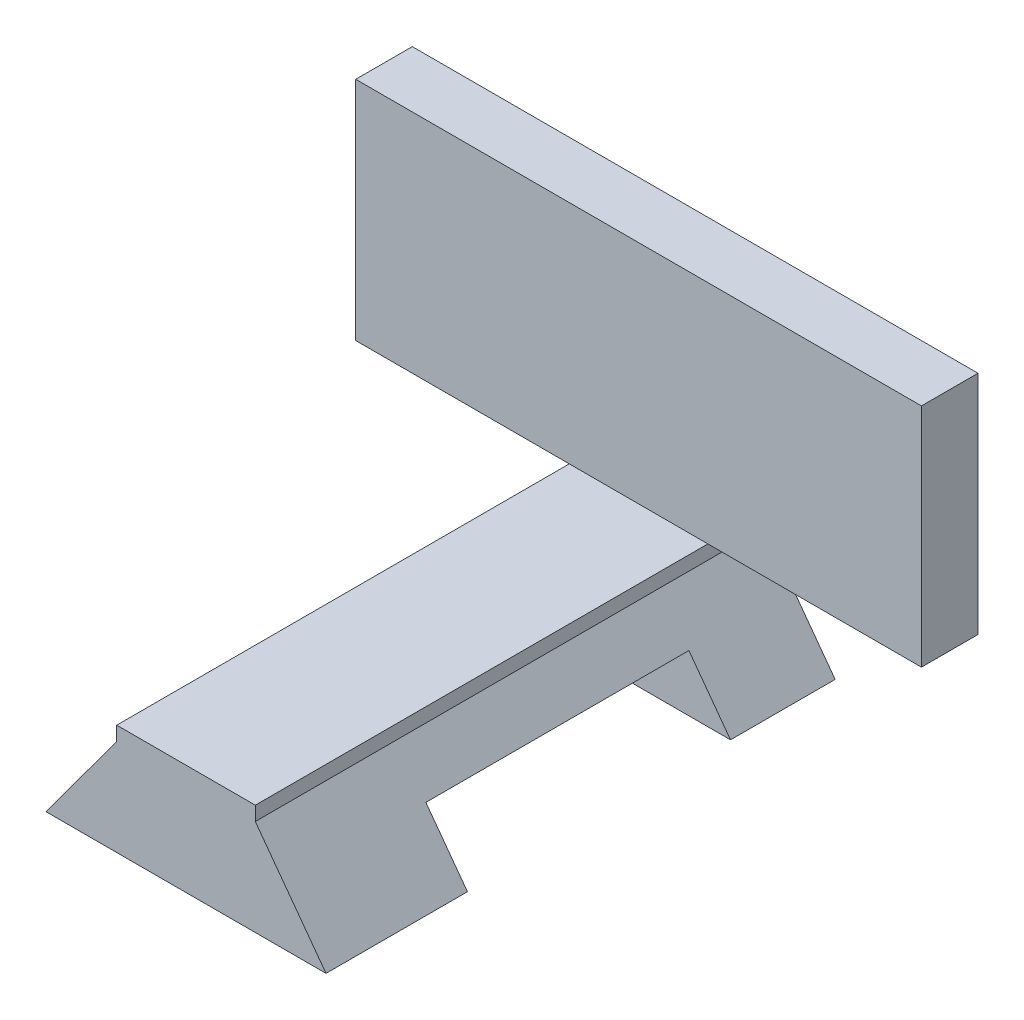
ISO-10303-21;
HEADER;
FILE_DESCRIPTION(('STEP AP214'),'2;1');
FILE_NAME('part.step','',(''),(''),'','','');
FILE_SCHEMA(('AUTOMOTIVE_DESIGN { 1 0 10303 214 1 1 1 1 }'));
ENDSEC;
DATA;
#1=APPLICATION_CONTEXT('core data for automotive mechanical design processes');
#2=APPLICATION_PROTOCOL_DEFINITION('international standard','automotive_design',2000,#1);
#3=PRODUCT_CONTEXT('',#1,'mechanical');
#4=PRODUCT('Part','Part','',(#3));
#5=PRODUCT_RELATED_PRODUCT_CATEGORY('part','',(#4));
#6=PRODUCT_DEFINITION_FORMATION('','',#4);
#7=PRODUCT_DEFINITION_CONTEXT('part definition',#1,'design');
#8=PRODUCT_DEFINITION('design','',#6,#7);
#9=PRODUCT_DEFINITION_SHAPE('','',#8);
#10=(LENGTH_UNIT() NAMED_UNIT(*) SI_UNIT(.MILLI.,.METRE.));
#11=(NAMED_UNIT(*) PLANE_ANGLE_UNIT() SI_UNIT($,.RADIAN.));
#12=(NAMED_UNIT(*) SI_UNIT($,.STERADIAN.) SOLID_ANGLE_UNIT());
#13=UNCERTAINTY_MEASURE_WITH_UNIT(LENGTH_MEASURE(1.E-05),#10,'distance_accuracy_value','');
#14=(GEOMETRIC_REPRESENTATION_CONTEXT(3) GLOBAL_UNCERTAINTY_ASSIGNED_CONTEXT((#13)) GLOBAL_UNIT_ASSIGNED_CONTEXT((#10,
#11,#12)) REPRESENTATION_CONTEXT('',''));
#15=CARTESIAN_POINT('',(0.,0.,0.));
#16=DIRECTION('',(0.,0.,1.));
#17=DIRECTION('',(1.,0.,0.));
#18=AXIS2_PLACEMENT_3D('',#15,#16,#17);
#19=CARTESIAN_POINT('',(-4.95,-3.4,18.));
#20=DIRECTION('',(0.,1.,0.));
#21=DIRECTION('',(-1.,0.,0.));
#22=AXIS2_PLACEMENT_3D('',#19,#20,#21);
#23=PLANE('',#22);
#24=DIRECTION('',(0.,0.,-1.));
#25=VECTOR('',#24,1.);
#26=CARTESIAN_POINT('',(-4.95,-3.4,18.));
#27=LINE('',#26,#25);
#28=CARTESIAN_POINT('',(-4.95,-3.4,18.));
#29=VERTEX_POINT('',#28);
#30=CARTESIAN_POINT('',(-4.95,-3.4,13.));
#31=VERTEX_POINT('',#30);
#32=EDGE_CURVE('E121',#29,#31,#27,.T.);
#33=ORIENTED_EDGE('',*,*,#32,.T.);
#34=DIRECTION('',(1.,0.,0.));
#35=VECTOR('',#34,1.);
#36=CARTESIAN_POINT('',(-10.,-3.4,13.));
#37=LINE('',#36,#35);
#38=CARTESIAN_POINT('',(4.95,-3.4,13.));
#39=VERTEX_POINT('',#38);
#40=EDGE_CURVE('E236',#31,#39,#37,.T.);
#41=ORIENTED_EDGE('',*,*,#40,.T.);
#42=DIRECTION('',(0.,0.,-1.));
#43=VECTOR('',#42,1.);
#44=CARTESIAN_POINT('',(4.95,-3.4,18.));
#45=LINE('',#44,#43);
#46=CARTESIAN_POINT('',(4.95,-3.4,18.));
#47=VERTEX_POINT('',#46);
#48=EDGE_CURVE('E133',#47,#39,#45,.T.);
#49=ORIENTED_EDGE('',*,*,#48,.F.);
#50=DIRECTION('',(1.,0.,0.));
#51=VECTOR('',#50,1.);
#52=CARTESIAN_POINT('',(-4.95,-3.4,18.));
#53=LINE('',#52,#51);
#54=EDGE_CURVE('E112',#29,#47,#53,.T.);
#55=ORIENTED_EDGE('',*,*,#54,.F.);
#56=EDGE_LOOP('',(#33,#41,#49,#55));
#57=FACE_BOUND('',#56,.T.);
#58=ADVANCED_FACE('F41',(#57),#23,.F.);
#59=CARTESIAN_POINT('',(-2.45,0.5,18.));
#60=DIRECTION('',(0.,-1.,0.));
#61=DIRECTION('',(1.,0.,0.));
#62=AXIS2_PLACEMENT_3D('',#59,#60,#61);
#63=PLANE('',#62);
#64=DIRECTION('',(1.,0.,0.));
#65=VECTOR('',#64,1.);
#66=CARTESIAN_POINT('',(-2.45,0.5,2.));
#67=LINE('',#66,#65);
#68=CARTESIAN_POINT('',(-2.45,0.5,2.));
#69=VERTEX_POINT('',#68);
#70=CARTESIAN_POINT('',(2.45,0.5,2.));
#71=VERTEX_POINT('',#70);
#72=EDGE_CURVE('E141',#69,#71,#67,.T.);
#73=ORIENTED_EDGE('',*,*,#72,.F.);
#74=DIRECTION('',(0.,0.,-1.));
#75=VECTOR('',#74,1.);
#76=CARTESIAN_POINT('',(-2.45,0.5,18.));
#77=LINE('',#76,#75);
#78=CARTESIAN_POINT('',(-2.45,0.5,18.));
#79=VERTEX_POINT('',#78);
#80=EDGE_CURVE('E157',#79,#69,#77,.T.);
#81=ORIENTED_EDGE('',*,*,#80,.F.);
#82=DIRECTION('',(-1.,0.,0.));
#83=VECTOR('',#82,1.);
#84=CARTESIAN_POINT('',(-2.45,0.5,18.));
#85=LINE('',#84,#83);
#86=CARTESIAN_POINT('',(2.45,0.500000000000001,18.));
#87=VERTEX_POINT('',#86);
#88=EDGE_CURVE('E98',#87,#79,#85,.T.);
#89=ORIENTED_EDGE('',*,*,#88,.F.);
#90=DIRECTION('',(0.,0.,-1.));
#91=VECTOR('',#90,1.);
#92=CARTESIAN_POINT('',(2.45,0.500000000000001,18.));
#93=LINE('',#92,#91);
#94=EDGE_CURVE('E160',#87,#71,#93,.T.);
#95=ORIENTED_EDGE('',*,*,#94,.T.);
#96=EDGE_LOOP('',(#73,#81,#89,#95));
#97=FACE_BOUND('',#96,.T.);
#98=ADVANCED_FACE('F190',(#97),#63,.F.);
#99=CARTESIAN_POINT('',(2.45,0.,18.));
#100=DIRECTION('',(-1.,0.,0.));
#101=DIRECTION('',(0.,0.,1.));
#102=AXIS2_PLACEMENT_3D('',#99,#100,#101);
#103=PLANE('',#102);
#104=DIRECTION('',(0.,0.,-1.));
#105=VECTOR('',#104,1.);
#106=CARTESIAN_POINT('',(2.45,0.5,2.));
#107=LINE('',#106,#105);
#108=CARTESIAN_POINT('',(2.45,0.5,0.));
#109=VERTEX_POINT('',#108);
#110=EDGE_CURVE('E270',#71,#109,#107,.T.);
#111=ORIENTED_EDGE('',*,*,#110,.F.);
#112=ORIENTED_EDGE('',*,*,#94,.F.);
#113=DIRECTION('',(0.,1.,0.));
#114=VECTOR('',#113,1.);
#115=CARTESIAN_POINT('',(2.45,0.,18.));
#116=LINE('',#115,#114);
#117=CARTESIAN_POINT('',(2.45,0.,18.));
#118=VERTEX_POINT('',#117);
#119=EDGE_CURVE('E152',#118,#87,#116,.T.);
#120=ORIENTED_EDGE('',*,*,#119,.F.);
#121=DIRECTION('',(0.,0.,-1.));
#122=VECTOR('',#121,1.);
#123=CARTESIAN_POINT('',(2.45,0.,18.));
#124=LINE('',#123,#122);
#125=CARTESIAN_POINT('',(2.45,0.,0.));
#126=VERTEX_POINT('',#125);
#127=EDGE_CURVE('E89',#118,#126,#124,.T.);
#128=ORIENTED_EDGE('',*,*,#127,.T.);
#129=DIRECTION('',(0.,1.,0.));
#130=VECTOR('',#129,1.);
#131=CARTESIAN_POINT('',(2.45,0.,0.));
#132=LINE('',#131,#130);
#133=EDGE_CURVE('E138',#126,#109,#132,.T.);
#134=ORIENTED_EDGE('',*,*,#133,.T.);
#135=EDGE_LOOP('',(#111,#112,#120,#128,#134));
#136=FACE_BOUND('',#135,.T.);
#137=ADVANCED_FACE('F196',(#136),#103,.F.);
#138=CARTESIAN_POINT('',(-2.45,0.,18.));
#139=DIRECTION('',(1.,0.,0.));
#140=DIRECTION('',(0.,0.,-1.));
#141=AXIS2_PLACEMENT_3D('',#138,#139,#140);
#142=PLANE('',#141);
#143=DIRECTION('',(0.,-1.,0.));
#144=VECTOR('',#143,1.);
#145=CARTESIAN_POINT('',(-2.45,0.,0.));
#146=LINE('',#145,#144);
#147=CARTESIAN_POINT('',(-2.45,0.5,0.));
#148=VERTEX_POINT('',#147);
#149=CARTESIAN_POINT('',(-2.45,0.,0.));
#150=VERTEX_POINT('',#149);
#151=EDGE_CURVE('E140',#148,#150,#146,.T.);
#152=ORIENTED_EDGE('',*,*,#151,.T.);
#153=DIRECTION('',(0.,0.,-1.));
#154=VECTOR('',#153,1.);
#155=CARTESIAN_POINT('',(-2.45,0.,18.));
#156=LINE('',#155,#154);
#157=CARTESIAN_POINT('',(-2.45,0.,18.));
#158=VERTEX_POINT('',#157);
#159=EDGE_CURVE('E129',#158,#150,#156,.T.);
#160=ORIENTED_EDGE('',*,*,#159,.F.);
#161=DIRECTION('',(0.,-1.,0.));
#162=VECTOR('',#161,1.);
#163=CARTESIAN_POINT('',(-2.45,0.,18.));
#164=LINE('',#163,#162);
#165=EDGE_CURVE('E115',#79,#158,#164,.T.);
#166=ORIENTED_EDGE('',*,*,#165,.F.);
#167=ORIENTED_EDGE('',*,*,#80,.T.);
#168=DIRECTION('',(0.,0.,-1.));
#169=VECTOR('',#168,1.);
#170=CARTESIAN_POINT('',(-2.45,0.5,2.));
#171=LINE('',#170,#169);
#172=EDGE_CURVE('E285',#69,#148,#171,.T.);
#173=ORIENTED_EDGE('',*,*,#172,.T.);
#174=EDGE_LOOP('',(#152,#160,#166,#167,#173));
#175=FACE_BOUND('',#174,.T.);
#176=ADVANCED_FACE('F208',(#175),#142,.F.);
#177=CARTESIAN_POINT('',(-2.45,0.,18.));
#178=DIRECTION('',(0.805651012649425,-0.592390450477518,0.));
#179=DIRECTION('',(0.592390450477518,0.805651012649425,0.));
#180=AXIS2_PLACEMENT_3D('',#177,#178,#179);
#181=PLANE('',#180);
#182=DIRECTION('',(0.,0.,1.));
#183=VECTOR('',#182,1.);
#184=CARTESIAN_POINT('',(-3.47941176470588,-1.4,18.));
#185=LINE('',#184,#183);
#186=CARTESIAN_POINT('',(-3.47941176470589,-1.4,3.69999999999999));
#187=VERTEX_POINT('',#186);
#188=CARTESIAN_POINT('',(-3.47941176470588,-1.4,13.));
#189=VERTEX_POINT('',#188);
#190=EDGE_CURVE('E231',#187,#189,#185,.T.);
#191=ORIENTED_EDGE('',*,*,#190,.T.);
#192=DIRECTION('',(-0.592390450477518,-0.805651012649425,0.));
#193=VECTOR('',#192,1.);
#194=CARTESIAN_POINT('',(-2.45,0.,13.));
#195=LINE('',#194,#193);
#196=EDGE_CURVE('E126',#189,#31,#195,.T.);
#197=ORIENTED_EDGE('',*,*,#196,.T.);
#198=ORIENTED_EDGE('',*,*,#32,.F.);
#199=DIRECTION('',(-0.592390450477518,-0.805651012649425,0.));
#200=VECTOR('',#199,1.);
#201=CARTESIAN_POINT('',(-2.45,0.,18.));
#202=LINE('',#201,#200);
#203=EDGE_CURVE('E108',#158,#29,#202,.T.);
#204=ORIENTED_EDGE('',*,*,#203,.F.);
#205=ORIENTED_EDGE('',*,*,#159,.T.);
#206=DIRECTION('',(-0.592390450477518,-0.805651012649425,0.));
#207=VECTOR('',#206,1.);
#208=CARTESIAN_POINT('',(-2.45,0.,0.));
#209=LINE('',#208,#207);
#210=CARTESIAN_POINT('',(-4.95,-3.4,0.));
#211=VERTEX_POINT('',#210);
#212=EDGE_CURVE('E144',#150,#211,#209,.T.);
#213=ORIENTED_EDGE('',*,*,#212,.T.);
#214=CARTESIAN_POINT('',(-4.95,-3.4,3.69999999999999));
#215=VERTEX_POINT('',#214);
#216=EDGE_CURVE('E130',#215,#211,#27,.T.);
#217=ORIENTED_EDGE('',*,*,#216,.F.);
#218=DIRECTION('',(0.592390450477518,0.805651012649425,0.));
#219=VECTOR('',#218,1.);
#220=CARTESIAN_POINT('',(-2.45,0.,3.69999999999999));
#221=LINE('',#220,#219);
#222=EDGE_CURVE('E234',#215,#187,#221,.T.);
#223=ORIENTED_EDGE('',*,*,#222,.T.);
#224=EDGE_LOOP('',(#191,#197,#198,#204,#205,#213,#217,#223));
#225=FACE_BOUND('',#224,.T.);
#226=ADVANCED_FACE('F123',(#225),#181,.F.);
#227=CARTESIAN_POINT('',(4.95,-3.4,3.69999999999999));
#228=VERTEX_POINT('',#227);
#229=CARTESIAN_POINT('',(4.95,-3.4,0.));
#230=VERTEX_POINT('',#229);
#231=EDGE_CURVE('E154',#228,#230,#45,.T.);
#232=ORIENTED_EDGE('',*,*,#231,.F.);
#233=DIRECTION('',(1.,0.,0.));
#234=VECTOR('',#233,1.);
#235=CARTESIAN_POINT('',(-10.,-3.4,3.69999999999999));
#236=LINE('',#235,#234);
#237=EDGE_CURVE('E56',#215,#228,#236,.T.);
#238=ORIENTED_EDGE('',*,*,#237,.F.);
#239=ORIENTED_EDGE('',*,*,#216,.T.);
#240=DIRECTION('',(1.,0.,0.));
#241=VECTOR('',#240,1.);
#242=CARTESIAN_POINT('',(-4.95,-3.4,0.));
#243=LINE('',#242,#241);
#244=EDGE_CURVE('E147',#211,#230,#243,.T.);
#245=ORIENTED_EDGE('',*,*,#244,.T.);
#246=EDGE_LOOP('',(#232,#238,#239,#245));
#247=FACE_BOUND('',#246,.T.);
#248=ADVANCED_FACE('F192',(#247),#23,.F.);
#249=CARTESIAN_POINT('',(2.45,0.,18.));
#250=DIRECTION('',(-0.805651012649424,-0.592390450477518,0.));
#251=DIRECTION('',(0.592390450477518,-0.805651012649425,0.));
#252=AXIS2_PLACEMENT_3D('',#249,#250,#251);
#253=PLANE('',#252);
#254=ORIENTED_EDGE('',*,*,#48,.T.);
#255=DIRECTION('',(-0.592390450477518,0.805651012649425,0.));
#256=VECTOR('',#255,1.);
#257=CARTESIAN_POINT('',(2.45,0.,13.));
#258=LINE('',#257,#256);
#259=CARTESIAN_POINT('',(3.47941176470588,-1.4,13.));
#260=VERTEX_POINT('',#259);
#261=EDGE_CURVE('E167',#39,#260,#258,.T.);
#262=ORIENTED_EDGE('',*,*,#261,.T.);
#263=DIRECTION('',(0.,0.,-1.));
#264=VECTOR('',#263,1.);
#265=CARTESIAN_POINT('',(3.47941176470588,-1.4,18.));
#266=LINE('',#265,#264);
#267=CARTESIAN_POINT('',(3.47941176470588,-1.4,3.69999999999999));
#268=VERTEX_POINT('',#267);
#269=EDGE_CURVE('E164',#260,#268,#266,.T.);
#270=ORIENTED_EDGE('',*,*,#269,.T.);
#271=DIRECTION('',(0.592390450477518,-0.805651012649425,0.));
#272=VECTOR('',#271,1.);
#273=CARTESIAN_POINT('',(2.45,0.,3.69999999999999));
#274=LINE('',#273,#272);
#275=EDGE_CURVE('E162',#268,#228,#274,.T.);
#276=ORIENTED_EDGE('',*,*,#275,.T.);
#277=ORIENTED_EDGE('',*,*,#231,.T.);
#278=DIRECTION('',(-0.592390450477518,0.805651012649424,0.));
#279=VECTOR('',#278,1.);
#280=CARTESIAN_POINT('',(2.45,0.,0.));
#281=LINE('',#280,#279);
#282=EDGE_CURVE('E150',#230,#126,#281,.T.);
#283=ORIENTED_EDGE('',*,*,#282,.T.);
#284=ORIENTED_EDGE('',*,*,#127,.F.);
#285=DIRECTION('',(-0.592390450477518,0.805651012649424,0.));
#286=VECTOR('',#285,1.);
#287=CARTESIAN_POINT('',(2.45,0.,18.));
#288=LINE('',#287,#286);
#289=EDGE_CURVE('E65',#47,#118,#288,.T.);
#290=ORIENTED_EDGE('',*,*,#289,.F.);
#291=EDGE_LOOP('',(#254,#262,#270,#276,#277,#283,#284,#290));
#292=FACE_BOUND('',#291,.T.);
#293=ADVANCED_FACE('F201',(#292),#253,.F.);
#294=CARTESIAN_POINT('',(0.,0.,18.));
#295=DIRECTION('',(0.,0.,-1.));
#296=DIRECTION('',(-1.,0.,0.));
#297=AXIS2_PLACEMENT_3D('',#294,#295,#296);
#298=PLANE('',#297);
#299=ORIENTED_EDGE('',*,*,#119,.T.);
#300=ORIENTED_EDGE('',*,*,#88,.T.);
#301=ORIENTED_EDGE('',*,*,#165,.T.);
#302=ORIENTED_EDGE('',*,*,#203,.T.);
#303=ORIENTED_EDGE('',*,*,#54,.T.);
#304=ORIENTED_EDGE('',*,*,#289,.T.);
#305=EDGE_LOOP('',(#299,#300,#301,#302,#303,#304));
#306=FACE_BOUND('',#305,.T.);
#307=ADVANCED_FACE('F110',(#306),#298,.F.);
#308=CARTESIAN_POINT('',(0.,0.,0.));
#309=DIRECTION('',(0.,0.,-1.));
#310=DIRECTION('',(-1.,0.,0.));
#311=AXIS2_PLACEMENT_3D('',#308,#309,#310);
#312=PLANE('',#311);
#313=CARTESIAN_POINT('',(-6.2,3.,0.));
#314=DIRECTION('',(0.,0.,-1.));
#315=DIRECTION('',(1.,0.,0.));
#316=AXIS2_PLACEMENT_3D('',#313,#314,#315);
#317=CIRCLE('',#316,1.4);
#318=CARTESIAN_POINT('',(-4.8,3.,0.));
#319=VERTEX_POINT('',#318);
#320=EDGE_CURVE('E376',#319,#319,#317,.T.);
#321=ORIENTED_EDGE('',*,*,#320,.F.);
#322=EDGE_LOOP('',(#321));
#323=FACE_BOUND('',#322,.T.);
#324=CARTESIAN_POINT('',(6.2,3.,0.));
#325=DIRECTION('',(0.,0.,-1.));
#326=DIRECTION('',(-1.,0.,0.));
#327=AXIS2_PLACEMENT_3D('',#324,#325,#326);
#328=CIRCLE('',#327,1.4);
#329=CARTESIAN_POINT('',(4.8,3.,0.));
#330=VERTEX_POINT('',#329);
#331=EDGE_CURVE('E241',#330,#330,#328,.T.);
#332=ORIENTED_EDGE('',*,*,#331,.F.);
#333=EDGE_LOOP('',(#332));
#334=FACE_BOUND('',#333,.T.);
#335=ORIENTED_EDGE('',*,*,#133,.F.);
#336=ORIENTED_EDGE('',*,*,#282,.F.);
#337=ORIENTED_EDGE('',*,*,#244,.F.);
#338=ORIENTED_EDGE('',*,*,#212,.F.);
#339=ORIENTED_EDGE('',*,*,#151,.F.);
#340=DIRECTION('',(1.,0.,0.));
#341=VECTOR('',#340,1.);
#342=CARTESIAN_POINT('',(0.,0.499999999999999,0.));
#343=LINE('',#342,#341);
#344=CARTESIAN_POINT('',(-10.,0.5,0.));
#345=VERTEX_POINT('',#344);
#346=EDGE_CURVE('E245',#345,#148,#343,.T.);
#347=ORIENTED_EDGE('',*,*,#346,.F.);
#348=DIRECTION('',(0.,1.,0.));
#349=VECTOR('',#348,1.);
#350=CARTESIAN_POINT('',(-10.,0.,0.));
#351=LINE('',#350,#349);
#352=CARTESIAN_POINT('',(-10.,8.5,0.));
#353=VERTEX_POINT('',#352);
#354=EDGE_CURVE('E261',#345,#353,#351,.T.);
#355=ORIENTED_EDGE('',*,*,#354,.T.);
#356=DIRECTION('',(1.,0.,0.));
#357=VECTOR('',#356,1.);
#358=CARTESIAN_POINT('',(0.,8.5,0.));
#359=LINE('',#358,#357);
#360=CARTESIAN_POINT('',(10.,8.5,0.));
#361=VERTEX_POINT('',#360);
#362=EDGE_CURVE('E264',#353,#361,#359,.T.);
#363=ORIENTED_EDGE('',*,*,#362,.T.);
#364=DIRECTION('',(0.,1.,0.));
#365=VECTOR('',#364,1.);
#366=CARTESIAN_POINT('',(10.,0.,0.));
#367=LINE('',#366,#365);
#368=CARTESIAN_POINT('',(10.,0.499999999999998,0.));
#369=VERTEX_POINT('',#368);
#370=EDGE_CURVE('E267',#369,#361,#367,.T.);
#371=ORIENTED_EDGE('',*,*,#370,.F.);
#372=EDGE_CURVE('E250',#109,#369,#343,.T.);
#373=ORIENTED_EDGE('',*,*,#372,.F.);
#374=EDGE_LOOP('',(#335,#336,#337,#338,#339,#347,#355,#363,#371,#373));
#375=FACE_BOUND('',#374,.T.);
#376=ADVANCED_FACE('F298',(#323,#334,#375),#312,.T.);
#377=CARTESIAN_POINT('',(0.,0.,2.));
#378=DIRECTION('',(0.,0.,-1.));
#379=DIRECTION('',(-1.,0.,0.));
#380=AXIS2_PLACEMENT_3D('',#377,#378,#379);
#381=PLANE('',#380);
#382=DIRECTION('',(1.,0.,0.));
#383=VECTOR('',#382,1.);
#384=CARTESIAN_POINT('',(0.,0.499999999999999,2.));
#385=LINE('',#384,#383);
#386=CARTESIAN_POINT('',(-10.,0.5,2.));
#387=VERTEX_POINT('',#386);
#388=EDGE_CURVE('E246',#387,#69,#385,.T.);
#389=ORIENTED_EDGE('',*,*,#388,.T.);
#390=ORIENTED_EDGE('',*,*,#72,.T.);
#391=CARTESIAN_POINT('',(10.,0.499999999999998,2.));
#392=VERTEX_POINT('',#391);
#393=EDGE_CURVE('E251',#71,#392,#385,.T.);
#394=ORIENTED_EDGE('',*,*,#393,.T.);
#395=DIRECTION('',(0.,1.,0.));
#396=VECTOR('',#395,1.);
#397=CARTESIAN_POINT('',(10.,0.,2.));
#398=LINE('',#397,#396);
#399=CARTESIAN_POINT('',(10.,8.5,2.));
#400=VERTEX_POINT('',#399);
#401=EDGE_CURVE('E257',#392,#400,#398,.T.);
#402=ORIENTED_EDGE('',*,*,#401,.T.);
#403=DIRECTION('',(1.,0.,0.));
#404=VECTOR('',#403,1.);
#405=CARTESIAN_POINT('',(0.,8.5,2.));
#406=LINE('',#405,#404);
#407=CARTESIAN_POINT('',(-10.,8.5,2.));
#408=VERTEX_POINT('',#407);
#409=EDGE_CURVE('E254',#408,#400,#406,.T.);
#410=ORIENTED_EDGE('',*,*,#409,.F.);
#411=DIRECTION('',(0.,1.,0.));
#412=VECTOR('',#411,1.);
#413=CARTESIAN_POINT('',(-10.,0.,2.));
#414=LINE('',#413,#412);
#415=EDGE_CURVE('E249',#387,#408,#414,.T.);
#416=ORIENTED_EDGE('',*,*,#415,.F.);
#417=EDGE_LOOP('',(#389,#390,#394,#402,#410,#416));
#418=FACE_BOUND('',#417,.T.);
#419=ADVANCED_FACE('F351',(#418),#381,.F.);
#420=CARTESIAN_POINT('',(0.,0.499999999999999,2.));
#421=DIRECTION('',(0.,1.,0.));
#422=DIRECTION('',(-1.,0.,0.));
#423=AXIS2_PLACEMENT_3D('',#420,#421,#422);
#424=PLANE('',#423);
#425=ORIENTED_EDGE('',*,*,#372,.T.);
#426=DIRECTION('',(0.,0.,-1.));
#427=VECTOR('',#426,1.);
#428=CARTESIAN_POINT('',(10.,0.499999999999998,2.));
#429=LINE('',#428,#427);
#430=EDGE_CURVE('E273',#392,#369,#429,.T.);
#431=ORIENTED_EDGE('',*,*,#430,.F.);
#432=ORIENTED_EDGE('',*,*,#393,.F.);
#433=ORIENTED_EDGE('',*,*,#110,.T.);
#434=EDGE_LOOP('',(#425,#431,#432,#433));
#435=FACE_BOUND('',#434,.T.);
#436=ADVANCED_FACE('F348',(#435),#424,.F.);
#437=CARTESIAN_POINT('',(10.,0.,2.));
#438=DIRECTION('',(-1.,0.,0.));
#439=DIRECTION('',(0.,0.,1.));
#440=AXIS2_PLACEMENT_3D('',#437,#438,#439);
#441=PLANE('',#440);
#442=ORIENTED_EDGE('',*,*,#370,.T.);
#443=DIRECTION('',(0.,0.,-1.));
#444=VECTOR('',#443,1.);
#445=CARTESIAN_POINT('',(10.,8.5,2.));
#446=LINE('',#445,#444);
#447=EDGE_CURVE('E276',#400,#361,#446,.T.);
#448=ORIENTED_EDGE('',*,*,#447,.F.);
#449=ORIENTED_EDGE('',*,*,#401,.F.);
#450=ORIENTED_EDGE('',*,*,#430,.T.);
#451=EDGE_LOOP('',(#442,#448,#449,#450));
#452=FACE_BOUND('',#451,.T.);
#453=ADVANCED_FACE('F356',(#452),#441,.F.);
#454=CARTESIAN_POINT('',(0.,8.5,2.));
#455=DIRECTION('',(0.,1.,0.));
#456=DIRECTION('',(-1.,0.,0.));
#457=AXIS2_PLACEMENT_3D('',#454,#455,#456);
#458=PLANE('',#457);
#459=ORIENTED_EDGE('',*,*,#362,.F.);
#460=DIRECTION('',(0.,0.,-1.));
#461=VECTOR('',#460,1.);
#462=CARTESIAN_POINT('',(-10.,8.5,2.));
#463=LINE('',#462,#461);
#464=EDGE_CURVE('E279',#408,#353,#463,.T.);
#465=ORIENTED_EDGE('',*,*,#464,.F.);
#466=ORIENTED_EDGE('',*,*,#409,.T.);
#467=ORIENTED_EDGE('',*,*,#447,.T.);
#468=EDGE_LOOP('',(#459,#465,#466,#467));
#469=FACE_BOUND('',#468,.T.);
#470=ADVANCED_FACE('F359',(#469),#458,.T.);
#471=CARTESIAN_POINT('',(-10.,0.,2.));
#472=DIRECTION('',(-1.,0.,0.));
#473=DIRECTION('',(0.,0.,1.));
#474=AXIS2_PLACEMENT_3D('',#471,#472,#473);
#475=PLANE('',#474);
#476=ORIENTED_EDGE('',*,*,#354,.F.);
#477=DIRECTION('',(0.,0.,-1.));
#478=VECTOR('',#477,1.);
#479=CARTESIAN_POINT('',(-10.,0.5,2.));
#480=LINE('',#479,#478);
#481=EDGE_CURVE('E282',#387,#345,#480,.T.);
#482=ORIENTED_EDGE('',*,*,#481,.F.);
#483=ORIENTED_EDGE('',*,*,#415,.T.);
#484=ORIENTED_EDGE('',*,*,#464,.T.);
#485=EDGE_LOOP('',(#476,#482,#483,#484));
#486=FACE_BOUND('',#485,.T.);
#487=ADVANCED_FACE('F345',(#486),#475,.T.);
#488=ORIENTED_EDGE('',*,*,#346,.T.);
#489=ORIENTED_EDGE('',*,*,#172,.F.);
#490=ORIENTED_EDGE('',*,*,#388,.F.);
#491=ORIENTED_EDGE('',*,*,#481,.T.);
#492=EDGE_LOOP('',(#488,#489,#490,#491));
#493=FACE_BOUND('',#492,.T.);
#494=ADVANCED_FACE('F338',(#493),#424,.F.);
#495=CARTESIAN_POINT('',(-10.,-3.4,13.));
#496=DIRECTION('',(0.,0.,1.));
#497=DIRECTION('',(0.,-1.,0.));
#498=AXIS2_PLACEMENT_3D('',#495,#496,#497);
#499=PLANE('',#498);
#500=DIRECTION('',(1.,0.,0.));
#501=VECTOR('',#500,1.);
#502=CARTESIAN_POINT('',(-10.,-1.4,13.));
#503=LINE('',#502,#501);
#504=EDGE_CURVE('E232',#189,#260,#503,.T.);
#505=ORIENTED_EDGE('',*,*,#504,.T.);
#506=ORIENTED_EDGE('',*,*,#261,.F.);
#507=ORIENTED_EDGE('',*,*,#40,.F.);
#508=ORIENTED_EDGE('',*,*,#196,.F.);
#509=EDGE_LOOP('',(#505,#506,#507,#508));
#510=FACE_BOUND('',#509,.T.);
#511=ADVANCED_FACE('F336',(#510),#499,.F.);
#512=CARTESIAN_POINT('',(-10.,-1.4,13.));
#513=DIRECTION('',(0.,1.,0.));
#514=DIRECTION('',(0.,0.,1.));
#515=AXIS2_PLACEMENT_3D('',#512,#513,#514);
#516=PLANE('',#515);
#517=DIRECTION('',(1.,0.,0.));
#518=VECTOR('',#517,1.);
#519=CARTESIAN_POINT('',(-10.,-1.4,3.69999999999999));
#520=LINE('',#519,#518);
#521=EDGE_CURVE('E221',#187,#268,#520,.T.);
#522=ORIENTED_EDGE('',*,*,#521,.T.);
#523=ORIENTED_EDGE('',*,*,#269,.F.);
#524=ORIENTED_EDGE('',*,*,#504,.F.);
#525=ORIENTED_EDGE('',*,*,#190,.F.);
#526=EDGE_LOOP('',(#522,#523,#524,#525));
#527=FACE_BOUND('',#526,.T.);
#528=ADVANCED_FACE('F227',(#527),#516,.F.);
#529=CARTESIAN_POINT('',(-10.,-3.4,3.69999999999999));
#530=DIRECTION('',(0.,0.,-1.));
#531=DIRECTION('',(-1.,0.,0.));
#532=AXIS2_PLACEMENT_3D('',#529,#530,#531);
#533=PLANE('',#532);
#534=ORIENTED_EDGE('',*,*,#237,.T.);
#535=ORIENTED_EDGE('',*,*,#275,.F.);
#536=ORIENTED_EDGE('',*,*,#521,.F.);
#537=ORIENTED_EDGE('',*,*,#222,.F.);
#538=EDGE_LOOP('',(#534,#535,#536,#537));
#539=FACE_BOUND('',#538,.T.);
#540=ADVANCED_FACE('F219',(#539),#533,.F.);
#541=CARTESIAN_POINT('',(6.2,3.,-2.));
#542=DIRECTION('',(0.,0.,1.));
#543=DIRECTION('',(1.,0.,0.));
#544=AXIS2_PLACEMENT_3D('',#541,#542,#543);
#545=CYLINDRICAL_SURFACE('',#544,1.4);
#546=CARTESIAN_POINT('',(6.2,3.,-1.5));
#547=DIRECTION('',(0.,0.,-1.));
#548=DIRECTION('',(-1.,0.,0.));
#549=AXIS2_PLACEMENT_3D('',#546,#547,#548);
#550=CIRCLE('',#549,1.4);
#551=CARTESIAN_POINT('',(4.8,3.,-1.5));
#552=VERTEX_POINT('',#551);
#553=EDGE_CURVE('E11',#552,#552,#550,.F.);
#554=ORIENTED_EDGE('',*,*,#553,.T.);
#555=EDGE_LOOP('',(#554));
#556=FACE_BOUND('',#555,.T.);
#557=ORIENTED_EDGE('',*,*,#331,.T.);
#558=EDGE_LOOP('',(#557));
#559=FACE_BOUND('',#558,.T.);
#560=ADVANCED_FACE('F392',(#556,#559),#545,.T.);
#561=CARTESIAN_POINT('',(6.2,3.,-2.));
#562=DIRECTION('',(0.,0.,-1.));
#563=DIRECTION('',(-1.,0.,0.));
#564=AXIS2_PLACEMENT_3D('',#561,#562,#563);
#565=PLANE('',#564);
#566=CARTESIAN_POINT('',(6.2,3.,-2.));
#567=DIRECTION('',(0.,0.,-1.));
#568=DIRECTION('',(-1.,0.,0.));
#569=AXIS2_PLACEMENT_3D('',#566,#567,#568);
#570=CIRCLE('',#569,0.9);
#571=CARTESIAN_POINT('',(5.3,3.,-2.));
#572=VERTEX_POINT('',#571);
#573=EDGE_CURVE('E49',#572,#572,#570,.T.);
#574=ORIENTED_EDGE('',*,*,#573,.T.);
#575=EDGE_LOOP('',(#574));
#576=FACE_BOUND('',#575,.T.);
#577=ADVANCED_FACE('F178',(#576),#565,.T.);
#578=CARTESIAN_POINT('',(-6.2,3.,-2.));
#579=DIRECTION('',(0.,0.,1.));
#580=DIRECTION('',(1.,0.,0.));
#581=AXIS2_PLACEMENT_3D('',#578,#579,#580);
#582=CYLINDRICAL_SURFACE('',#581,1.4);
#583=CARTESIAN_POINT('',(-6.2,3.,-1.5));
#584=DIRECTION('',(0.,0.,1.));
#585=DIRECTION('',(1.,0.,0.));
#586=AXIS2_PLACEMENT_3D('',#583,#584,#585);
#587=CIRCLE('',#586,1.4);
#588=CARTESIAN_POINT('',(-4.8,3.,-1.5));
#589=VERTEX_POINT('',#588);
#590=EDGE_CURVE('E173',#589,#589,#587,.T.);
#591=ORIENTED_EDGE('',*,*,#590,.T.);
#592=EDGE_LOOP('',(#591));
#593=FACE_BOUND('',#592,.T.);
#594=ORIENTED_EDGE('',*,*,#320,.T.);
#595=EDGE_LOOP('',(#594));
#596=FACE_BOUND('',#595,.T.);
#597=ADVANCED_FACE('F382',(#593,#596),#582,.T.);
#598=CARTESIAN_POINT('',(-6.2,3.,-2.));
#599=DIRECTION('',(0.,0.,1.));
#600=DIRECTION('',(1.,0.,0.));
#601=AXIS2_PLACEMENT_3D('',#598,#599,#600);
#602=PLANE('',#601);
#603=CARTESIAN_POINT('',(-6.2,3.,-2.));
#604=DIRECTION('',(0.,0.,1.));
#605=DIRECTION('',(1.,0.,0.));
#606=AXIS2_PLACEMENT_3D('',#603,#604,#605);
#607=CIRCLE('',#606,0.899999999999999);
#608=CARTESIAN_POINT('',(-5.3,3.,-2.));
#609=VERTEX_POINT('',#608);
#610=EDGE_CURVE('E170',#609,#609,#607,.F.);
#611=ORIENTED_EDGE('',*,*,#610,.T.);
#612=EDGE_LOOP('',(#611));
#613=FACE_BOUND('',#612,.T.);
#614=ADVANCED_FACE('F186',(#613),#602,.F.);
#615=CARTESIAN_POINT('',(-6.2,3.,-1.5));
#616=DIRECTION('',(0.,0.,1.));
#617=DIRECTION('',(1.,0.,0.));
#618=AXIS2_PLACEMENT_3D('',#615,#616,#617);
#619=TOROIDAL_SURFACE('',#618,0.899999999999999,0.5);
#620=ORIENTED_EDGE('',*,*,#590,.F.);
#621=EDGE_LOOP('',(#620));
#622=FACE_BOUND('',#621,.T.);
#623=ORIENTED_EDGE('',*,*,#610,.F.);
#624=EDGE_LOOP('',(#623));
#625=FACE_BOUND('',#624,.T.);
#626=ADVANCED_FACE('F181',(#622,#625),#619,.T.);
#627=CARTESIAN_POINT('',(6.2,3.,-1.5));
#628=DIRECTION('',(0.,0.,-1.));
#629=DIRECTION('',(-1.,0.,0.));
#630=AXIS2_PLACEMENT_3D('',#627,#628,#629);
#631=TOROIDAL_SURFACE('',#630,0.9,0.5);
#632=ORIENTED_EDGE('',*,*,#553,.F.);
#633=EDGE_LOOP('',(#632));
#634=FACE_BOUND('',#633,.T.);
#635=ORIENTED_EDGE('',*,*,#573,.F.);
#636=EDGE_LOOP('',(#635));
#637=FACE_BOUND('',#636,.T.);
#638=ADVANCED_FACE('F43',(#634,#637),#631,.T.);
#639=CLOSED_SHELL('',(#58,#98,#137,#176,#226,#248,#293,#307,#376,#419,#436,#453,#470,#487,#494,
#511,#528,#540,#560,#577,#597,#614,#626,#638));
#640=MANIFOLD_SOLID_BREP('B2',#639);
#641=ADVANCED_BREP_SHAPE_REPRESENTATION('',(#18,#640),#14);
#642=SHAPE_DEFINITION_REPRESENTATION(#9,#641);
ENDSEC;
END-ISO-10303-21;
